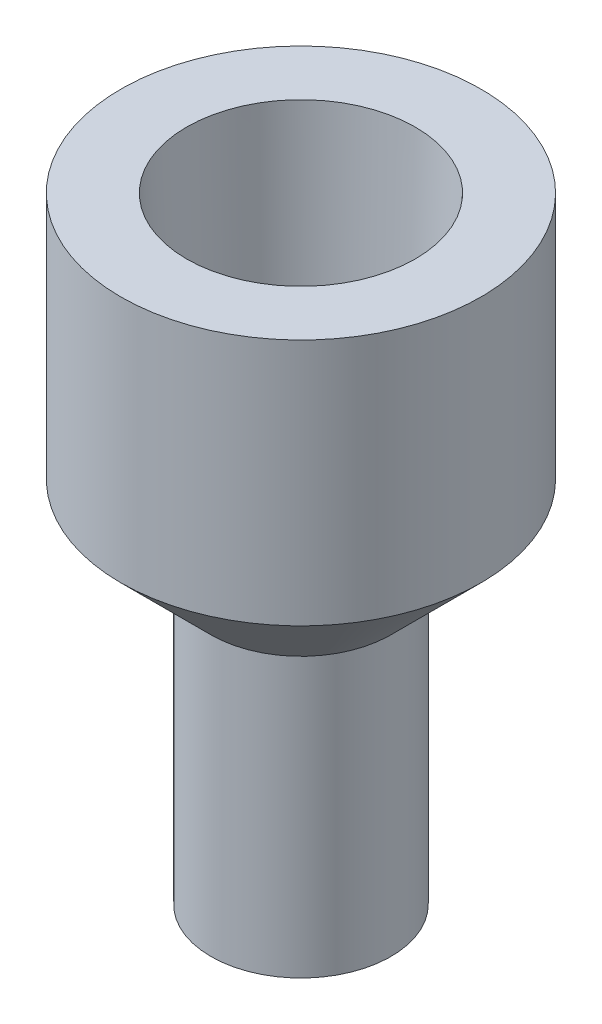
ISO-10303-21;
HEADER;
FILE_DESCRIPTION(('STEP AP214'),'2;1');
FILE_NAME('part.step','',(''),(''),'','','');
FILE_SCHEMA(('AUTOMOTIVE_DESIGN { 1 0 10303 214 1 1 1 1 }'));
ENDSEC;
DATA;
#1=APPLICATION_CONTEXT('core data for automotive mechanical design processes');
#2=APPLICATION_PROTOCOL_DEFINITION('international standard','automotive_design',2000,#1);
#3=PRODUCT_CONTEXT('',#1,'mechanical');
#4=PRODUCT('Part','Part','',(#3));
#5=PRODUCT_RELATED_PRODUCT_CATEGORY('part','',(#4));
#6=PRODUCT_DEFINITION_FORMATION('','',#4);
#7=PRODUCT_DEFINITION_CONTEXT('part definition',#1,'design');
#8=PRODUCT_DEFINITION('design','',#6,#7);
#9=PRODUCT_DEFINITION_SHAPE('','',#8);
#10=(LENGTH_UNIT() NAMED_UNIT(*) SI_UNIT(.MILLI.,.METRE.));
#11=(NAMED_UNIT(*) PLANE_ANGLE_UNIT() SI_UNIT($,.RADIAN.));
#12=(NAMED_UNIT(*) SI_UNIT($,.STERADIAN.) SOLID_ANGLE_UNIT());
#13=UNCERTAINTY_MEASURE_WITH_UNIT(LENGTH_MEASURE(1.E-05),#10,'distance_accuracy_value','');
#14=(GEOMETRIC_REPRESENTATION_CONTEXT(3) GLOBAL_UNCERTAINTY_ASSIGNED_CONTEXT((#13)) GLOBAL_UNIT_ASSIGNED_CONTEXT((#10,
#11,#12)) REPRESENTATION_CONTEXT('',''));
#15=CARTESIAN_POINT('',(0.,0.,0.));
#16=DIRECTION('',(0.,0.,1.));
#17=DIRECTION('',(1.,0.,0.));
#18=AXIS2_PLACEMENT_3D('',#15,#16,#17);
#19=CARTESIAN_POINT('',(0.,20.8,0.));
#20=DIRECTION('',(0.,-1.,0.));
#21=DIRECTION('',(0.,0.,-1.));
#22=AXIS2_PLACEMENT_3D('',#19,#20,#21);
#23=CYLINDRICAL_SURFACE('',#22,5.08);
#24=CARTESIAN_POINT('',(0.,15.72,0.));
#25=DIRECTION('',(0.,1.,0.));
#26=DIRECTION('',(0.,0.,1.));
#27=AXIS2_PLACEMENT_3D('',#24,#25,#26);
#28=CIRCLE('',#27,5.08);
#29=CARTESIAN_POINT('',(0.,15.72,5.08));
#30=VERTEX_POINT('',#29);
#31=EDGE_CURVE('E11',#30,#30,#28,.F.);
#32=ORIENTED_EDGE('',*,*,#31,.T.);
#33=EDGE_LOOP('',(#32));
#34=FACE_BOUND('',#33,.T.);
#35=CARTESIAN_POINT('',(0.,0.,0.));
#36=DIRECTION('',(0.,1.,0.));
#37=DIRECTION('',(0.,0.,1.));
#38=AXIS2_PLACEMENT_3D('',#35,#36,#37);
#39=CIRCLE('',#38,5.08);
#40=CARTESIAN_POINT('',(0.,0.,5.08));
#41=VERTEX_POINT('',#40);
#42=EDGE_CURVE('E51',#41,#41,#39,.T.);
#43=ORIENTED_EDGE('',*,*,#42,.T.);
#44=EDGE_LOOP('',(#43));
#45=FACE_BOUND('',#44,.T.);
#46=ADVANCED_FACE('F43',(#34,#45),#23,.T.);
#47=CARTESIAN_POINT('',(0.,0.,0.));
#48=DIRECTION('',(0.,1.,0.));
#49=DIRECTION('',(0.,0.,1.));
#50=AXIS2_PLACEMENT_3D('',#47,#48,#49);
#51=PLANE('',#50);
#52=CARTESIAN_POINT('',(0.,0.,0.));
#53=DIRECTION('',(0.,-1.,0.));
#54=DIRECTION('',(0.,0.,-1.));
#55=AXIS2_PLACEMENT_3D('',#52,#53,#54);
#56=CIRCLE('',#55,2.525);
#57=CARTESIAN_POINT('',(0.,0.,-2.525));
#58=VERTEX_POINT('',#57);
#59=EDGE_CURVE('E72',#58,#58,#56,.T.);
#60=ORIENTED_EDGE('',*,*,#59,.F.);
#61=EDGE_LOOP('',(#60));
#62=FACE_BOUND('',#61,.T.);
#63=ORIENTED_EDGE('',*,*,#42,.F.);
#64=EDGE_LOOP('',(#63));
#65=FACE_BOUND('',#64,.T.);
#66=ADVANCED_FACE('F137',(#62,#65),#51,.F.);
#67=CARTESIAN_POINT('',(0.,34.77,0.));
#68=DIRECTION('',(0.,-1.,0.));
#69=DIRECTION('',(0.,0.,-1.));
#70=AXIS2_PLACEMENT_3D('',#67,#68,#69);
#71=CYLINDRICAL_SURFACE('',#70,10.16);
#72=CARTESIAN_POINT('',(0.,34.77,0.));
#73=DIRECTION('',(0.,1.,0.));
#74=DIRECTION('',(0.,0.,1.));
#75=AXIS2_PLACEMENT_3D('',#72,#73,#74);
#76=CIRCLE('',#75,10.16);
#77=CARTESIAN_POINT('',(0.,34.77,10.16));
#78=VERTEX_POINT('',#77);
#79=EDGE_CURVE('E55',#78,#78,#76,.T.);
#80=ORIENTED_EDGE('',*,*,#79,.F.);
#81=EDGE_LOOP('',(#80));
#82=FACE_BOUND('',#81,.T.);
#83=CARTESIAN_POINT('',(0.,20.8,0.));
#84=DIRECTION('',(0.,1.,0.));
#85=DIRECTION('',(0.,0.,1.));
#86=AXIS2_PLACEMENT_3D('',#83,#84,#85);
#87=CIRCLE('',#86,10.16);
#88=CARTESIAN_POINT('',(0.,20.8,10.16));
#89=VERTEX_POINT('',#88);
#90=EDGE_CURVE('E59',#89,#89,#87,.T.);
#91=ORIENTED_EDGE('',*,*,#90,.T.);
#92=EDGE_LOOP('',(#91));
#93=FACE_BOUND('',#92,.T.);
#94=ADVANCED_FACE('F140',(#82,#93),#71,.T.);
#95=CARTESIAN_POINT('',(0.,34.77,0.));
#96=DIRECTION('',(0.,1.,0.));
#97=DIRECTION('',(0.,0.,1.));
#98=AXIS2_PLACEMENT_3D('',#95,#96,#97);
#99=PLANE('',#98);
#100=CARTESIAN_POINT('',(0.,34.77,0.));
#101=DIRECTION('',(0.,1.,0.));
#102=DIRECTION('',(0.,0.,1.));
#103=AXIS2_PLACEMENT_3D('',#100,#101,#102);
#104=CIRCLE('',#103,6.450000054);
#105=CARTESIAN_POINT('',(0.,34.77,6.450000054));
#106=VERTEX_POINT('',#105);
#107=EDGE_CURVE('E63',#106,#106,#104,.T.);
#108=ORIENTED_EDGE('',*,*,#107,.F.);
#109=EDGE_LOOP('',(#108));
#110=FACE_BOUND('',#109,.T.);
#111=ORIENTED_EDGE('',*,*,#79,.T.);
#112=EDGE_LOOP('',(#111));
#113=FACE_BOUND('',#112,.T.);
#114=ADVANCED_FACE('F90',(#110,#113),#99,.T.);
#115=CARTESIAN_POINT('',(0.,23.34,0.));
#116=DIRECTION('',(0.,-1.,0.));
#117=DIRECTION('',(0.,0.,-1.));
#118=AXIS2_PLACEMENT_3D('',#115,#116,#117);
#119=PLANE('',#118);
#120=CARTESIAN_POINT('',(0.,23.34,0.));
#121=DIRECTION('',(0.,-1.,0.));
#122=DIRECTION('',(0.,0.,-1.));
#123=AXIS2_PLACEMENT_3D('',#120,#121,#122);
#124=CIRCLE('',#123,6.05215787881266);
#125=CARTESIAN_POINT('',(0.,23.34,-6.05215787881266));
#126=VERTEX_POINT('',#125);
#127=EDGE_CURVE('E67',#126,#126,#124,.T.);
#128=ORIENTED_EDGE('',*,*,#127,.F.);
#129=EDGE_LOOP('',(#128));
#130=FACE_BOUND('',#129,.T.);
#131=ADVANCED_FACE('F79',(#130),#119,.F.);
#132=CARTESIAN_POINT('',(0.,23.34,0.));
#133=DIRECTION('',(0.,1.,0.));
#134=DIRECTION('',(0.,0.,1.));
#135=AXIS2_PLACEMENT_3D('',#132,#133,#134);
#136=CONICAL_SURFACE('',#135,6.05215787881266,0.0347927933343152);
#137=ORIENTED_EDGE('',*,*,#127,.T.);
#138=EDGE_LOOP('',(#137));
#139=FACE_BOUND('',#138,.T.);
#140=ORIENTED_EDGE('',*,*,#107,.T.);
#141=EDGE_LOOP('',(#140));
#142=FACE_BOUND('',#141,.T.);
#143=ADVANCED_FACE('F89',(#139,#142),#136,.F.);
#144=CARTESIAN_POINT('',(0.,20.8,0.));
#145=DIRECTION('',(0.,1.,0.));
#146=DIRECTION('',(0.,0.,1.));
#147=AXIS2_PLACEMENT_3D('',#144,#145,#146);
#148=CONICAL_SURFACE('',#147,10.16,0.785398163397453);
#149=ORIENTED_EDGE('',*,*,#31,.F.);
#150=EDGE_LOOP('',(#149));
#151=FACE_BOUND('',#150,.T.);
#152=ORIENTED_EDGE('',*,*,#90,.F.);
#153=EDGE_LOOP('',(#152));
#154=FACE_BOUND('',#153,.T.);
#155=ADVANCED_FACE('F46',(#151,#154),#148,.T.);
#156=CARTESIAN_POINT('',(0.,18.26,0.));
#157=DIRECTION('',(0.,-1.,0.));
#158=DIRECTION('',(0.,0.,-1.));
#159=AXIS2_PLACEMENT_3D('',#156,#157,#158);
#160=PLANE('',#159);
#161=CARTESIAN_POINT('',(0.,18.26,0.));
#162=DIRECTION('',(0.,-1.,0.));
#163=DIRECTION('',(0.,0.,-1.));
#164=AXIS2_PLACEMENT_3D('',#161,#162,#163);
#165=CIRCLE('',#164,2.325);
#166=CARTESIAN_POINT('',(0.,18.26,-2.325));
#167=VERTEX_POINT('',#166);
#168=EDGE_CURVE('E111',#167,#167,#165,.T.);
#169=ORIENTED_EDGE('',*,*,#168,.T.);
#170=EDGE_LOOP('',(#169));
#171=FACE_BOUND('',#170,.T.);
#172=ADVANCED_FACE('F120',(#171),#160,.T.);
#173=CARTESIAN_POINT('',(0.,18.26,0.));
#174=DIRECTION('',(0.,-1.,0.));
#175=DIRECTION('',(0.,0.,-1.));
#176=AXIS2_PLACEMENT_3D('',#173,#174,#175);
#177=CONICAL_SURFACE('',#176,2.325,0.0109524645584548);
#178=ORIENTED_EDGE('',*,*,#168,.F.);
#179=EDGE_LOOP('',(#178));
#180=FACE_BOUND('',#179,.T.);
#181=ORIENTED_EDGE('',*,*,#59,.T.);
#182=EDGE_LOOP('',(#181));
#183=FACE_BOUND('',#182,.T.);
#184=ADVANCED_FACE('F92',(#180,#183),#177,.F.);
#185=CLOSED_SHELL('',(#46,#66,#94,#114,#131,#143,#155,#172,#184));
#186=MANIFOLD_SOLID_BREP('B2',#185);
#187=ADVANCED_BREP_SHAPE_REPRESENTATION('',(#18,#186),#14);
#188=SHAPE_DEFINITION_REPRESENTATION(#9,#187);
ENDSEC;
END-ISO-10303-21;
